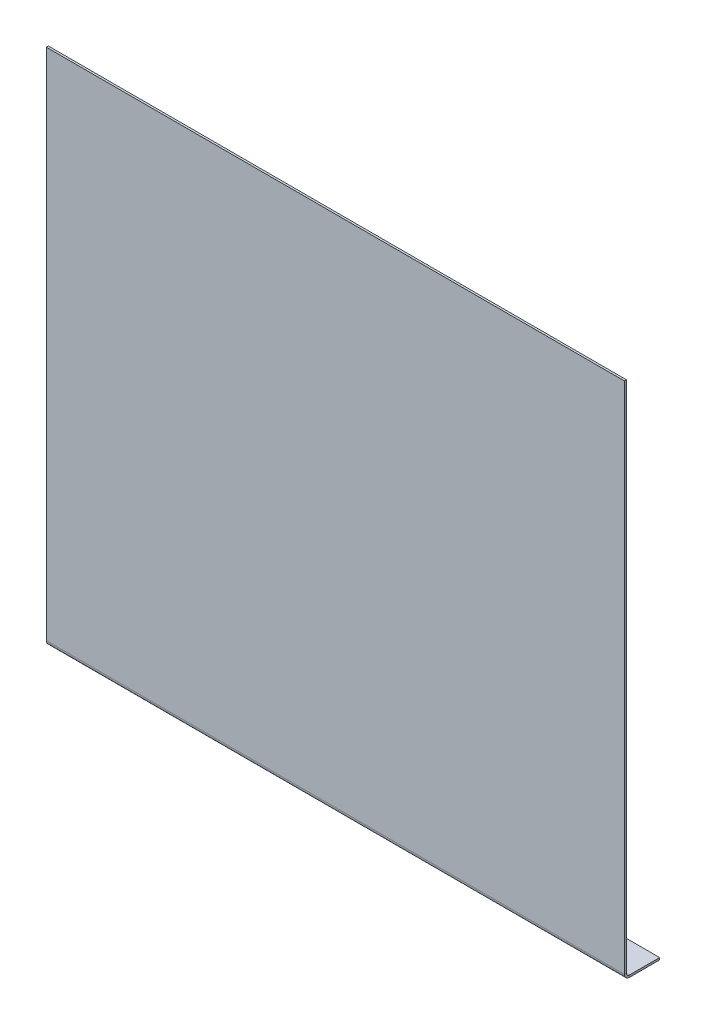
ISO-10303-21;
HEADER;
FILE_DESCRIPTION(('STEP AP214'),'2;1');
FILE_NAME('part.step','',(''),(''),'','','');
FILE_SCHEMA(('AUTOMOTIVE_DESIGN { 1 0 10303 214 1 1 1 1 }'));
ENDSEC;
DATA;
#1=APPLICATION_CONTEXT('core data for automotive mechanical design processes');
#2=APPLICATION_PROTOCOL_DEFINITION('international standard','automotive_design',2000,#1);
#3=PRODUCT_CONTEXT('',#1,'mechanical');
#4=PRODUCT('Part','Part','',(#3));
#5=PRODUCT_RELATED_PRODUCT_CATEGORY('part','',(#4));
#6=PRODUCT_DEFINITION_FORMATION('','',#4);
#7=PRODUCT_DEFINITION_CONTEXT('part definition',#1,'design');
#8=PRODUCT_DEFINITION('design','',#6,#7);
#9=PRODUCT_DEFINITION_SHAPE('','',#8);
#10=(LENGTH_UNIT() NAMED_UNIT(*) SI_UNIT(.MILLI.,.METRE.));
#11=(NAMED_UNIT(*) PLANE_ANGLE_UNIT() SI_UNIT($,.RADIAN.));
#12=(NAMED_UNIT(*) SI_UNIT($,.STERADIAN.) SOLID_ANGLE_UNIT());
#13=UNCERTAINTY_MEASURE_WITH_UNIT(LENGTH_MEASURE(1.E-05),#10,'distance_accuracy_value','');
#14=(GEOMETRIC_REPRESENTATION_CONTEXT(3) GLOBAL_UNCERTAINTY_ASSIGNED_CONTEXT((#13)) GLOBAL_UNIT_ASSIGNED_CONTEXT((#10,
#11,#12)) REPRESENTATION_CONTEXT('',''));
#15=CARTESIAN_POINT('',(0.,0.,0.));
#16=DIRECTION('',(0.,0.,1.));
#17=DIRECTION('',(1.,0.,0.));
#18=AXIS2_PLACEMENT_3D('',#15,#16,#17);
#19=CARTESIAN_POINT('',(90.,70.,-0.64));
#20=DIRECTION('',(1.,0.,0.));
#21=DIRECTION('',(0.,1.,0.));
#22=AXIS2_PLACEMENT_3D('',#19,#20,#21);
#23=PLANE('',#22);
#24=DIRECTION('',(0.,1.,0.));
#25=VECTOR('',#24,1.);
#26=CARTESIAN_POINT('',(90.,70.,0.));
#27=LINE('',#26,#25);
#28=CARTESIAN_POINT('',(90.,-90.,0.));
#29=VERTEX_POINT('',#28);
#30=CARTESIAN_POINT('',(90.,70.,0.));
#31=VERTEX_POINT('',#30);
#32=EDGE_CURVE('E113',#29,#31,#27,.T.);
#33=ORIENTED_EDGE('',*,*,#32,.F.);
#34=DIRECTION('',(0.,0.,1.));
#35=VECTOR('',#34,1.);
#36=CARTESIAN_POINT('',(90.,-90.,-0.64));
#37=LINE('',#36,#35);
#38=CARTESIAN_POINT('',(90.,-90.,-0.640000000000006));
#39=VERTEX_POINT('',#38);
#40=EDGE_CURVE('E13',#39,#29,#37,.T.);
#41=ORIENTED_EDGE('',*,*,#40,.F.);
#42=DIRECTION('',(0.,1.,0.));
#43=VECTOR('',#42,1.);
#44=CARTESIAN_POINT('',(90.,70.,-0.64));
#45=LINE('',#44,#43);
#46=CARTESIAN_POINT('',(90.,70.,-0.64));
#47=VERTEX_POINT('',#46);
#48=EDGE_CURVE('E134',#39,#47,#45,.T.);
#49=ORIENTED_EDGE('',*,*,#48,.T.);
#50=DIRECTION('',(0.,0.,1.));
#51=VECTOR('',#50,1.);
#52=CARTESIAN_POINT('',(90.,70.,-0.64));
#53=LINE('',#52,#51);
#54=EDGE_CURVE('E68',#47,#31,#53,.T.);
#55=ORIENTED_EDGE('',*,*,#54,.T.);
#56=EDGE_LOOP('',(#33,#41,#49,#55));
#57=FACE_BOUND('',#56,.T.);
#58=ADVANCED_FACE('F65',(#57),#23,.T.);
#59=CARTESIAN_POINT('',(-90.,70.,-0.64));
#60=DIRECTION('',(-1.,0.,0.));
#61=DIRECTION('',(0.,-1.,0.));
#62=AXIS2_PLACEMENT_3D('',#59,#60,#61);
#63=PLANE('',#62);
#64=DIRECTION('',(0.,-1.,0.));
#65=VECTOR('',#64,1.);
#66=CARTESIAN_POINT('',(-90.,70.,0.));
#67=LINE('',#66,#65);
#68=CARTESIAN_POINT('',(-90.,70.,0.));
#69=VERTEX_POINT('',#68);
#70=CARTESIAN_POINT('',(-90.,-90.,0.));
#71=VERTEX_POINT('',#70);
#72=EDGE_CURVE('E133',#69,#71,#67,.T.);
#73=ORIENTED_EDGE('',*,*,#72,.F.);
#74=DIRECTION('',(0.,0.,1.));
#75=VECTOR('',#74,1.);
#76=CARTESIAN_POINT('',(-90.,70.,-0.64));
#77=LINE('',#76,#75);
#78=CARTESIAN_POINT('',(-90.,70.,-0.64));
#79=VERTEX_POINT('',#78);
#80=EDGE_CURVE('E83',#79,#69,#77,.T.);
#81=ORIENTED_EDGE('',*,*,#80,.F.);
#82=DIRECTION('',(0.,-1.,0.));
#83=VECTOR('',#82,1.);
#84=CARTESIAN_POINT('',(-90.,70.,-0.64));
#85=LINE('',#84,#83);
#86=CARTESIAN_POINT('',(-90.,-90.,-0.640000000000006));
#87=VERTEX_POINT('',#86);
#88=EDGE_CURVE('E144',#79,#87,#85,.T.);
#89=ORIENTED_EDGE('',*,*,#88,.T.);
#90=DIRECTION('',(0.,0.,1.));
#91=VECTOR('',#90,1.);
#92=CARTESIAN_POINT('',(-90.,-90.,-0.64));
#93=LINE('',#92,#91);
#94=EDGE_CURVE('E74',#87,#71,#93,.T.);
#95=ORIENTED_EDGE('',*,*,#94,.T.);
#96=EDGE_LOOP('',(#73,#81,#89,#95));
#97=FACE_BOUND('',#96,.T.);
#98=ADVANCED_FACE('F260',(#97),#63,.T.);
#99=CARTESIAN_POINT('',(-90.,70.,-0.64));
#100=DIRECTION('',(0.,1.,0.));
#101=DIRECTION('',(0.,0.,1.));
#102=AXIS2_PLACEMENT_3D('',#99,#100,#101);
#103=PLANE('',#102);
#104=DIRECTION('',(-1.,0.,0.));
#105=VECTOR('',#104,1.);
#106=CARTESIAN_POINT('',(-90.,70.,0.));
#107=LINE('',#106,#105);
#108=EDGE_CURVE('E129',#31,#69,#107,.T.);
#109=ORIENTED_EDGE('',*,*,#108,.F.);
#110=ORIENTED_EDGE('',*,*,#54,.F.);
#111=DIRECTION('',(-1.,0.,0.));
#112=VECTOR('',#111,1.);
#113=CARTESIAN_POINT('',(-90.,70.,-0.64));
#114=LINE('',#113,#112);
#115=EDGE_CURVE('E136',#47,#79,#114,.T.);
#116=ORIENTED_EDGE('',*,*,#115,.T.);
#117=ORIENTED_EDGE('',*,*,#80,.T.);
#118=EDGE_LOOP('',(#109,#110,#116,#117));
#119=FACE_BOUND('',#118,.T.);
#120=ADVANCED_FACE('F151',(#119),#103,.T.);
#121=CARTESIAN_POINT('',(0.,0.,-0.64));
#122=DIRECTION('',(0.,0.,1.));
#123=DIRECTION('',(1.,0.,0.));
#124=AXIS2_PLACEMENT_3D('',#121,#122,#123);
#125=PLANE('',#124);
#126=ORIENTED_EDGE('',*,*,#48,.F.);
#127=DIRECTION('',(1.,0.,0.));
#128=VECTOR('',#127,1.);
#129=CARTESIAN_POINT('',(-90.,-90.,-0.64));
#130=LINE('',#129,#128);
#131=EDGE_CURVE('E142',#87,#39,#130,.T.);
#132=ORIENTED_EDGE('',*,*,#131,.F.);
#133=ORIENTED_EDGE('',*,*,#88,.F.);
#134=ORIENTED_EDGE('',*,*,#115,.F.);
#135=EDGE_LOOP('',(#126,#132,#133,#134));
#136=FACE_BOUND('',#135,.T.);
#137=ADVANCED_FACE('F154',(#136),#125,.F.);
#138=CARTESIAN_POINT('',(0.,0.,0.));
#139=DIRECTION('',(0.,0.,1.));
#140=DIRECTION('',(1.,0.,0.));
#141=AXIS2_PLACEMENT_3D('',#138,#139,#140);
#142=PLANE('',#141);
#143=ORIENTED_EDGE('',*,*,#32,.T.);
#144=ORIENTED_EDGE('',*,*,#108,.T.);
#145=ORIENTED_EDGE('',*,*,#72,.T.);
#146=DIRECTION('',(1.,0.,0.));
#147=VECTOR('',#146,1.);
#148=CARTESIAN_POINT('',(-90.,-90.,0.));
#149=LINE('',#148,#147);
#150=EDGE_CURVE('E105',#71,#29,#149,.T.);
#151=ORIENTED_EDGE('',*,*,#150,.T.);
#152=EDGE_LOOP('',(#143,#144,#145,#151));
#153=FACE_BOUND('',#152,.T.);
#154=ADVANCED_FACE('F132',(#153),#142,.T.);
#155=CARTESIAN_POINT('',(90.,-90.,-1.64000000000001));
#156=DIRECTION('',(1.,0.,0.));
#157=DIRECTION('',(0.,0.,-1.));
#158=AXIS2_PLACEMENT_3D('',#155,#156,#157);
#159=PLANE('',#158);
#160=DIRECTION('',(0.,1.,0.));
#161=VECTOR('',#160,1.);
#162=CARTESIAN_POINT('',(90.,-91.64,-1.64));
#163=LINE('',#162,#161);
#164=CARTESIAN_POINT('',(90.,-91.,-1.64));
#165=VERTEX_POINT('',#164);
#166=CARTESIAN_POINT('',(90.,-91.64,-1.64));
#167=VERTEX_POINT('',#166);
#168=EDGE_CURVE('E161',#165,#167,#163,.F.);
#169=ORIENTED_EDGE('',*,*,#168,.F.);
#170=CARTESIAN_POINT('',(90.,-90.,-1.64000000000001));
#171=DIRECTION('',(-1.,0.,0.));
#172=DIRECTION('',(0.,0.,1.));
#173=AXIS2_PLACEMENT_3D('',#170,#171,#172);
#174=CIRCLE('',#173,1.);
#175=EDGE_CURVE('E122',#39,#165,#174,.F.);
#176=ORIENTED_EDGE('',*,*,#175,.F.);
#177=ORIENTED_EDGE('',*,*,#40,.T.);
#178=CARTESIAN_POINT('',(90.,-90.,-1.64000000000001));
#179=DIRECTION('',(-1.,0.,0.));
#180=DIRECTION('',(0.,0.,1.));
#181=AXIS2_PLACEMENT_3D('',#178,#179,#180);
#182=CIRCLE('',#181,1.64);
#183=EDGE_CURVE('E101',#29,#167,#182,.F.);
#184=ORIENTED_EDGE('',*,*,#183,.T.);
#185=EDGE_LOOP('',(#169,#176,#177,#184));
#186=FACE_BOUND('',#185,.T.);
#187=ADVANCED_FACE('F119',(#186),#159,.T.);
#188=CARTESIAN_POINT('',(-90.,-90.,-1.64000000000001));
#189=DIRECTION('',(1.,0.,0.));
#190=DIRECTION('',(0.,0.,-1.));
#191=AXIS2_PLACEMENT_3D('',#188,#189,#190);
#192=PLANE('',#191);
#193=CARTESIAN_POINT('',(-90.,-90.,-1.64000000000001));
#194=DIRECTION('',(-1.,0.,0.));
#195=DIRECTION('',(0.,0.,1.));
#196=AXIS2_PLACEMENT_3D('',#193,#194,#195);
#197=CIRCLE('',#196,1.);
#198=CARTESIAN_POINT('',(-90.,-91.,-1.64));
#199=VERTEX_POINT('',#198);
#200=EDGE_CURVE('E156',#199,#87,#197,.T.);
#201=ORIENTED_EDGE('',*,*,#200,.F.);
#202=DIRECTION('',(0.,1.,0.));
#203=VECTOR('',#202,1.);
#204=CARTESIAN_POINT('',(-90.,-91.,-1.64));
#205=LINE('',#204,#203);
#206=CARTESIAN_POINT('',(-90.,-91.64,-1.64));
#207=VERTEX_POINT('',#206);
#208=EDGE_CURVE('E167',#199,#207,#205,.F.);
#209=ORIENTED_EDGE('',*,*,#208,.T.);
#210=CARTESIAN_POINT('',(-90.,-90.,-1.64000000000001));
#211=DIRECTION('',(-1.,0.,0.));
#212=DIRECTION('',(0.,0.,1.));
#213=AXIS2_PLACEMENT_3D('',#210,#211,#212);
#214=CIRCLE('',#213,1.64);
#215=EDGE_CURVE('E114',#207,#71,#214,.T.);
#216=ORIENTED_EDGE('',*,*,#215,.T.);
#217=ORIENTED_EDGE('',*,*,#94,.F.);
#218=EDGE_LOOP('',(#201,#209,#216,#217));
#219=FACE_BOUND('',#218,.T.);
#220=ADVANCED_FACE('F258',(#219),#192,.F.);
#221=CARTESIAN_POINT('',(-90.,-90.,-1.64000000000001));
#222=DIRECTION('',(-1.,0.,0.));
#223=DIRECTION('',(0.,-1.,0.));
#224=AXIS2_PLACEMENT_3D('',#221,#222,#223);
#225=CYLINDRICAL_SURFACE('',#224,1.64);
#226=ORIENTED_EDGE('',*,*,#150,.F.);
#227=ORIENTED_EDGE('',*,*,#215,.F.);
#228=DIRECTION('',(-1.,0.,0.));
#229=VECTOR('',#228,1.);
#230=CARTESIAN_POINT('',(90.,-91.64,-1.64));
#231=LINE('',#230,#229);
#232=EDGE_CURVE('E109',#207,#167,#231,.F.);
#233=ORIENTED_EDGE('',*,*,#232,.T.);
#234=ORIENTED_EDGE('',*,*,#183,.F.);
#235=EDGE_LOOP('',(#226,#227,#233,#234));
#236=FACE_BOUND('',#235,.T.);
#237=ADVANCED_FACE('F102',(#236),#225,.T.);
#238=CARTESIAN_POINT('',(-90.,-90.,-1.64000000000001));
#239=DIRECTION('',(-1.,0.,0.));
#240=DIRECTION('',(0.,-1.,0.));
#241=AXIS2_PLACEMENT_3D('',#238,#239,#240);
#242=CYLINDRICAL_SURFACE('',#241,1.);
#243=ORIENTED_EDGE('',*,*,#131,.T.);
#244=ORIENTED_EDGE('',*,*,#175,.T.);
#245=DIRECTION('',(-1.,0.,0.));
#246=VECTOR('',#245,1.);
#247=CARTESIAN_POINT('',(90.,-91.,-1.64));
#248=LINE('',#247,#246);
#249=EDGE_CURVE('E163',#165,#199,#248,.T.);
#250=ORIENTED_EDGE('',*,*,#249,.T.);
#251=ORIENTED_EDGE('',*,*,#200,.T.);
#252=EDGE_LOOP('',(#243,#244,#250,#251));
#253=FACE_BOUND('',#252,.T.);
#254=ADVANCED_FACE('F259',(#253),#242,.F.);
#255=CARTESIAN_POINT('',(-90.,-91.64,-11.));
#256=DIRECTION('',(1.,0.,0.));
#257=DIRECTION('',(0.,0.,-1.));
#258=AXIS2_PLACEMENT_3D('',#255,#256,#257);
#259=PLANE('',#258);
#260=ORIENTED_EDGE('',*,*,#208,.F.);
#261=DIRECTION('',(0.,0.,1.));
#262=VECTOR('',#261,1.);
#263=CARTESIAN_POINT('',(-90.,-91.,-11.));
#264=LINE('',#263,#262);
#265=CARTESIAN_POINT('',(-90.,-91.,-11.));
#266=VERTEX_POINT('',#265);
#267=EDGE_CURVE('E171',#199,#266,#264,.F.);
#268=ORIENTED_EDGE('',*,*,#267,.T.);
#269=DIRECTION('',(0.,1.,0.));
#270=VECTOR('',#269,1.);
#271=CARTESIAN_POINT('',(-90.,-91.64,-11.));
#272=LINE('',#271,#270);
#273=CARTESIAN_POINT('',(-90.,-91.64,-11.));
#274=VERTEX_POINT('',#273);
#275=EDGE_CURVE('E158',#274,#266,#272,.T.);
#276=ORIENTED_EDGE('',*,*,#275,.F.);
#277=DIRECTION('',(0.,0.,-1.));
#278=VECTOR('',#277,1.);
#279=CARTESIAN_POINT('',(-90.,-91.64,3.63914346136966E-13));
#280=LINE('',#279,#278);
#281=EDGE_CURVE('E180',#207,#274,#280,.T.);
#282=ORIENTED_EDGE('',*,*,#281,.F.);
#283=EDGE_LOOP('',(#260,#268,#276,#282));
#284=FACE_BOUND('',#283,.T.);
#285=ADVANCED_FACE('F234',(#284),#259,.F.);
#286=CARTESIAN_POINT('',(90.,-91.64,-0.639999999999998));
#287=DIRECTION('',(-1.,0.,0.));
#288=DIRECTION('',(0.,0.,1.));
#289=AXIS2_PLACEMENT_3D('',#286,#287,#288);
#290=PLANE('',#289);
#291=ORIENTED_EDGE('',*,*,#168,.T.);
#292=DIRECTION('',(0.,0.,1.));
#293=VECTOR('',#292,1.);
#294=CARTESIAN_POINT('',(90.,-91.64,3.63914346136966E-13));
#295=LINE('',#294,#293);
#296=CARTESIAN_POINT('',(90.,-91.64,-11.));
#297=VERTEX_POINT('',#296);
#298=EDGE_CURVE('E186',#297,#167,#295,.T.);
#299=ORIENTED_EDGE('',*,*,#298,.F.);
#300=DIRECTION('',(0.,1.,0.));
#301=VECTOR('',#300,1.);
#302=CARTESIAN_POINT('',(90.,-91.64,-11.));
#303=LINE('',#302,#301);
#304=CARTESIAN_POINT('',(90.,-91.,-11.));
#305=VERTEX_POINT('',#304);
#306=EDGE_CURVE('E189',#297,#305,#303,.T.);
#307=ORIENTED_EDGE('',*,*,#306,.T.);
#308=DIRECTION('',(0.,0.,-1.));
#309=VECTOR('',#308,1.);
#310=CARTESIAN_POINT('',(90.,-91.,-0.64));
#311=LINE('',#310,#309);
#312=EDGE_CURVE('E177',#305,#165,#311,.F.);
#313=ORIENTED_EDGE('',*,*,#312,.T.);
#314=EDGE_LOOP('',(#291,#299,#307,#313));
#315=FACE_BOUND('',#314,.T.);
#316=ADVANCED_FACE('F282',(#315),#290,.F.);
#317=CARTESIAN_POINT('',(0.,-91.64,3.63914346136966E-13));
#318=DIRECTION('',(0.,1.,0.));
#319=DIRECTION('',(0.,0.,1.));
#320=AXIS2_PLACEMENT_3D('',#317,#318,#319);
#321=PLANE('',#320);
#322=CARTESIAN_POINT('',(-80.,-91.64,-6.50000000000003));
#323=DIRECTION('',(0.,1.,0.));
#324=DIRECTION('',(0.,0.,-1.));
#325=AXIS2_PLACEMENT_3D('',#322,#323,#324);
#326=CIRCLE('',#325,2.65);
#327=CARTESIAN_POINT('',(-80.,-91.6400000000001,-9.15000000000003));
#328=VERTEX_POINT('',#327);
#329=EDGE_CURVE('E164',#328,#328,#326,.T.);
#330=ORIENTED_EDGE('',*,*,#329,.T.);
#331=EDGE_LOOP('',(#330));
#332=FACE_BOUND('',#331,.T.);
#333=CARTESIAN_POINT('',(80.,-91.64,-6.50000000000003));
#334=DIRECTION('',(0.,1.,0.));
#335=DIRECTION('',(0.,0.,1.));
#336=AXIS2_PLACEMENT_3D('',#333,#334,#335);
#337=CIRCLE('',#336,2.65);
#338=CARTESIAN_POINT('',(80.,-91.64,-3.85000000000003));
#339=VERTEX_POINT('',#338);
#340=EDGE_CURVE('E194',#339,#339,#337,.T.);
#341=ORIENTED_EDGE('',*,*,#340,.T.);
#342=EDGE_LOOP('',(#341));
#343=FACE_BOUND('',#342,.T.);
#344=ORIENTED_EDGE('',*,*,#232,.F.);
#345=ORIENTED_EDGE('',*,*,#281,.T.);
#346=DIRECTION('',(1.,0.,0.));
#347=VECTOR('',#346,1.);
#348=CARTESIAN_POINT('',(0.,-91.64,-11.));
#349=LINE('',#348,#347);
#350=EDGE_CURVE('E183',#274,#297,#349,.T.);
#351=ORIENTED_EDGE('',*,*,#350,.T.);
#352=ORIENTED_EDGE('',*,*,#298,.T.);
#353=EDGE_LOOP('',(#344,#345,#351,#352));
#354=FACE_BOUND('',#353,.T.);
#355=ADVANCED_FACE('F206',(#332,#343,#354),#321,.F.);
#356=CARTESIAN_POINT('',(0.,-91.,3.61679798080106E-13));
#357=DIRECTION('',(0.,1.,0.));
#358=DIRECTION('',(0.,0.,1.));
#359=AXIS2_PLACEMENT_3D('',#356,#357,#358);
#360=PLANE('',#359);
#361=CARTESIAN_POINT('',(-80.,-91.,-6.50000000000003));
#362=DIRECTION('',(0.,1.,0.));
#363=DIRECTION('',(0.,0.,-1.));
#364=AXIS2_PLACEMENT_3D('',#361,#362,#363);
#365=CIRCLE('',#364,2.65);
#366=CARTESIAN_POINT('',(-80.,-91.,-9.15000000000003));
#367=VERTEX_POINT('',#366);
#368=EDGE_CURVE('E200',#367,#367,#365,.T.);
#369=ORIENTED_EDGE('',*,*,#368,.F.);
#370=EDGE_LOOP('',(#369));
#371=FACE_BOUND('',#370,.T.);
#372=CARTESIAN_POINT('',(80.,-91.,-6.50000000000003));
#373=DIRECTION('',(0.,1.,0.));
#374=DIRECTION('',(0.,0.,1.));
#375=AXIS2_PLACEMENT_3D('',#372,#373,#374);
#376=CIRCLE('',#375,2.65);
#377=CARTESIAN_POINT('',(80.,-91.,-3.85000000000003));
#378=VERTEX_POINT('',#377);
#379=EDGE_CURVE('E197',#378,#378,#376,.T.);
#380=ORIENTED_EDGE('',*,*,#379,.F.);
#381=EDGE_LOOP('',(#380));
#382=FACE_BOUND('',#381,.T.);
#383=ORIENTED_EDGE('',*,*,#267,.F.);
#384=ORIENTED_EDGE('',*,*,#249,.F.);
#385=ORIENTED_EDGE('',*,*,#312,.F.);
#386=DIRECTION('',(-1.,0.,0.));
#387=VECTOR('',#386,1.);
#388=CARTESIAN_POINT('',(90.,-91.,-11.));
#389=LINE('',#388,#387);
#390=EDGE_CURVE('E174',#266,#305,#389,.F.);
#391=ORIENTED_EDGE('',*,*,#390,.F.);
#392=EDGE_LOOP('',(#383,#384,#385,#391));
#393=FACE_BOUND('',#392,.T.);
#394=ADVANCED_FACE('F216',(#371,#382,#393),#360,.T.);
#395=CARTESIAN_POINT('',(90.,-91.64,-11.));
#396=DIRECTION('',(0.,0.,1.));
#397=DIRECTION('',(0.,-1.,0.));
#398=AXIS2_PLACEMENT_3D('',#395,#396,#397);
#399=PLANE('',#398);
#400=ORIENTED_EDGE('',*,*,#390,.T.);
#401=ORIENTED_EDGE('',*,*,#306,.F.);
#402=ORIENTED_EDGE('',*,*,#350,.F.);
#403=ORIENTED_EDGE('',*,*,#275,.T.);
#404=EDGE_LOOP('',(#400,#401,#402,#403));
#405=FACE_BOUND('',#404,.T.);
#406=ADVANCED_FACE('F219',(#405),#399,.F.);
#407=CARTESIAN_POINT('',(80.,-91.64,-6.50000000000003));
#408=DIRECTION('',(0.,1.,0.));
#409=DIRECTION('',(0.,0.,1.));
#410=AXIS2_PLACEMENT_3D('',#407,#408,#409);
#411=CYLINDRICAL_SURFACE('',#410,2.65);
#412=ORIENTED_EDGE('',*,*,#340,.F.);
#413=EDGE_LOOP('',(#412));
#414=FACE_BOUND('',#413,.T.);
#415=ORIENTED_EDGE('',*,*,#379,.T.);
#416=EDGE_LOOP('',(#415));
#417=FACE_BOUND('',#416,.T.);
#418=ADVANCED_FACE('F212',(#414,#417),#411,.F.);
#419=CARTESIAN_POINT('',(-80.,-91.64,-6.50000000000003));
#420=DIRECTION('',(0.,1.,0.));
#421=DIRECTION('',(0.,0.,1.));
#422=AXIS2_PLACEMENT_3D('',#419,#420,#421);
#423=CYLINDRICAL_SURFACE('',#422,2.65);
#424=ORIENTED_EDGE('',*,*,#329,.F.);
#425=EDGE_LOOP('',(#424));
#426=FACE_BOUND('',#425,.T.);
#427=ORIENTED_EDGE('',*,*,#368,.T.);
#428=EDGE_LOOP('',(#427));
#429=FACE_BOUND('',#428,.T.);
#430=ADVANCED_FACE('F209',(#426,#429),#423,.F.);
#431=CLOSED_SHELL('',(#58,#98,#120,#137,#154,#187,#220,#237,#254,#285,#316,#355,#394,#406,#418,#430));
#432=MANIFOLD_SOLID_BREP('B2',#431);
#433=ADVANCED_BREP_SHAPE_REPRESENTATION('',(#18,#432),#14);
#434=SHAPE_DEFINITION_REPRESENTATION(#9,#433);
ENDSEC;
END-ISO-10303-21;
